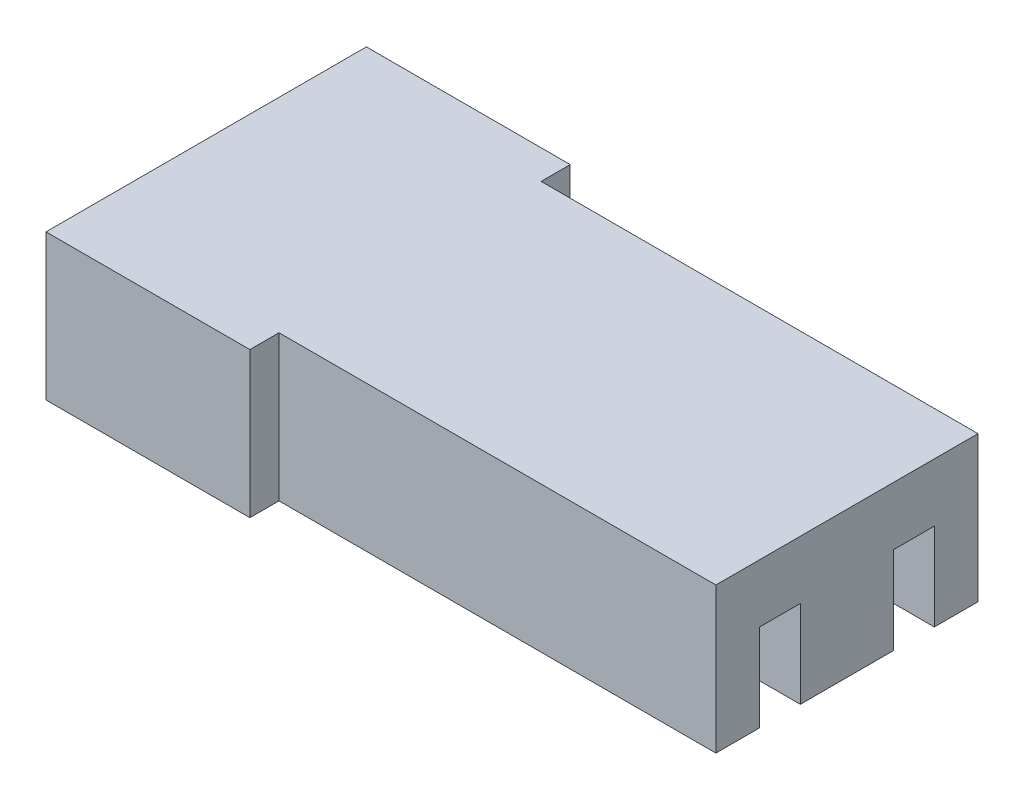
ISO-10303-21;
HEADER;
FILE_DESCRIPTION(('STEP AP214'),'2;1');
FILE_NAME('part.step','',(''),(''),'','','');
FILE_SCHEMA(('AUTOMOTIVE_DESIGN { 1 0 10303 214 1 1 1 1 }'));
ENDSEC;
DATA;
#1=APPLICATION_CONTEXT('core data for automotive mechanical design processes');
#2=APPLICATION_PROTOCOL_DEFINITION('international standard','automotive_design',2000,#1);
#3=PRODUCT_CONTEXT('',#1,'mechanical');
#4=PRODUCT('Part','Part','',(#3));
#5=PRODUCT_RELATED_PRODUCT_CATEGORY('part','',(#4));
#6=PRODUCT_DEFINITION_FORMATION('','',#4);
#7=PRODUCT_DEFINITION_CONTEXT('part definition',#1,'design');
#8=PRODUCT_DEFINITION('design','',#6,#7);
#9=PRODUCT_DEFINITION_SHAPE('','',#8);
#10=(LENGTH_UNIT() NAMED_UNIT(*) SI_UNIT(.MILLI.,.METRE.));
#11=(NAMED_UNIT(*) PLANE_ANGLE_UNIT() SI_UNIT($,.RADIAN.));
#12=(NAMED_UNIT(*) SI_UNIT($,.STERADIAN.) SOLID_ANGLE_UNIT());
#13=UNCERTAINTY_MEASURE_WITH_UNIT(LENGTH_MEASURE(1.E-05),#10,'distance_accuracy_value','');
#14=(GEOMETRIC_REPRESENTATION_CONTEXT(3) GLOBAL_UNCERTAINTY_ASSIGNED_CONTEXT((#13)) GLOBAL_UNIT_ASSIGNED_CONTEXT((#10,
#11,#12)) REPRESENTATION_CONTEXT('',''));
#15=CARTESIAN_POINT('',(0.,0.,0.));
#16=DIRECTION('',(0.,0.,1.));
#17=DIRECTION('',(1.,0.,0.));
#18=AXIS2_PLACEMENT_3D('',#15,#16,#17);
#19=CARTESIAN_POINT('',(7.5,2.,-4.5));
#20=DIRECTION('',(-1.,0.,0.));
#21=DIRECTION('',(0.,0.,1.));
#22=AXIS2_PLACEMENT_3D('',#19,#20,#21);
#23=PLANE('',#22);
#24=DIRECTION('',(0.,-1.,0.));
#25=VECTOR('',#24,1.);
#26=CARTESIAN_POINT('',(7.5,2.,4.5));
#27=LINE('',#26,#25);
#28=CARTESIAN_POINT('',(7.5,2.,4.5));
#29=VERTEX_POINT('',#28);
#30=CARTESIAN_POINT('',(7.5,-3.,4.5));
#31=VERTEX_POINT('',#30);
#32=EDGE_CURVE('E455',#29,#31,#27,.T.);
#33=ORIENTED_EDGE('',*,*,#32,.T.);
#34=DIRECTION('',(0.,0.,-1.));
#35=VECTOR('',#34,1.);
#36=CARTESIAN_POINT('',(7.5,-3.,3.));
#37=LINE('',#36,#35);
#38=CARTESIAN_POINT('',(7.5,-3.,3.));
#39=VERTEX_POINT('',#38);
#40=EDGE_CURVE('E319',#31,#39,#37,.T.);
#41=ORIENTED_EDGE('',*,*,#40,.T.);
#42=DIRECTION('',(0.,1.,0.));
#43=VECTOR('',#42,1.);
#44=CARTESIAN_POINT('',(7.5,-3.,3.));
#45=LINE('',#44,#43);
#46=CARTESIAN_POINT('',(7.5,0.,3.));
#47=VERTEX_POINT('',#46);
#48=EDGE_CURVE('E351',#39,#47,#45,.T.);
#49=ORIENTED_EDGE('',*,*,#48,.T.);
#50=DIRECTION('',(0.,0.,-1.));
#51=VECTOR('',#50,1.);
#52=CARTESIAN_POINT('',(7.5,0.,-4.5));
#53=LINE('',#52,#51);
#54=CARTESIAN_POINT('',(7.5,0.,1.6));
#55=VERTEX_POINT('',#54);
#56=EDGE_CURVE('E456',#47,#55,#53,.T.);
#57=ORIENTED_EDGE('',*,*,#56,.T.);
#58=DIRECTION('',(0.,1.,0.));
#59=VECTOR('',#58,1.);
#60=CARTESIAN_POINT('',(7.5,-3.,1.6));
#61=LINE('',#60,#59);
#62=CARTESIAN_POINT('',(7.5,-3.,1.6));
#63=VERTEX_POINT('',#62);
#64=EDGE_CURVE('E314',#63,#55,#61,.T.);
#65=ORIENTED_EDGE('',*,*,#64,.F.);
#66=DIRECTION('',(0.,0.,-1.));
#67=VECTOR('',#66,1.);
#68=CARTESIAN_POINT('',(7.5,-3.,-1.6));
#69=LINE('',#68,#67);
#70=CARTESIAN_POINT('',(7.5,-3.,-1.6));
#71=VERTEX_POINT('',#70);
#72=EDGE_CURVE('E288',#63,#71,#69,.T.);
#73=ORIENTED_EDGE('',*,*,#72,.T.);
#74=DIRECTION('',(0.,1.,0.));
#75=VECTOR('',#74,1.);
#76=CARTESIAN_POINT('',(7.5,-3.,-1.6));
#77=LINE('',#76,#75);
#78=CARTESIAN_POINT('',(7.5,0.,-1.6));
#79=VERTEX_POINT('',#78);
#80=EDGE_CURVE('E311',#71,#79,#77,.T.);
#81=ORIENTED_EDGE('',*,*,#80,.T.);
#82=CARTESIAN_POINT('',(7.5,0.,-3.));
#83=VERTEX_POINT('',#82);
#84=EDGE_CURVE('E420',#79,#83,#53,.T.);
#85=ORIENTED_EDGE('',*,*,#84,.T.);
#86=DIRECTION('',(0.,1.,0.));
#87=VECTOR('',#86,1.);
#88=CARTESIAN_POINT('',(7.5,-3.,-3.));
#89=LINE('',#88,#87);
#90=CARTESIAN_POINT('',(7.5,-3.,-3.));
#91=VERTEX_POINT('',#90);
#92=EDGE_CURVE('E416',#91,#83,#89,.T.);
#93=ORIENTED_EDGE('',*,*,#92,.F.);
#94=DIRECTION('',(0.,0.,-1.));
#95=VECTOR('',#94,1.);
#96=CARTESIAN_POINT('',(7.5,-3.,-3.));
#97=LINE('',#96,#95);
#98=CARTESIAN_POINT('',(7.5,-3.,-4.5));
#99=VERTEX_POINT('',#98);
#100=EDGE_CURVE('E375',#91,#99,#97,.T.);
#101=ORIENTED_EDGE('',*,*,#100,.T.);
#102=DIRECTION('',(0.,-1.,0.));
#103=VECTOR('',#102,1.);
#104=CARTESIAN_POINT('',(7.5,2.,-4.5));
#105=LINE('',#104,#103);
#106=CARTESIAN_POINT('',(7.5,2.,-4.5));
#107=VERTEX_POINT('',#106);
#108=EDGE_CURVE('E483',#107,#99,#105,.T.);
#109=ORIENTED_EDGE('',*,*,#108,.F.);
#110=DIRECTION('',(0.,0.,-1.));
#111=VECTOR('',#110,1.);
#112=CARTESIAN_POINT('',(7.5,2.,-4.5));
#113=LINE('',#112,#111);
#114=EDGE_CURVE('E429',#29,#107,#113,.T.);
#115=ORIENTED_EDGE('',*,*,#114,.F.);
#116=EDGE_LOOP('',(#33,#41,#49,#57,#65,#73,#81,#85,#93,#101,#109,#115));
#117=FACE_BOUND('',#116,.T.);
#118=ADVANCED_FACE('F39',(#117),#23,.F.);
#119=CARTESIAN_POINT('',(-7.5,2.,-4.5));
#120=DIRECTION('',(0.,0.,1.));
#121=DIRECTION('',(1.,0.,0.));
#122=AXIS2_PLACEMENT_3D('',#119,#120,#121);
#123=PLANE('',#122);
#124=ORIENTED_EDGE('',*,*,#108,.T.);
#125=DIRECTION('',(-1.,0.,0.));
#126=VECTOR('',#125,1.);
#127=CARTESIAN_POINT('',(7.5,-3.,-4.5));
#128=LINE('',#127,#126);
#129=CARTESIAN_POINT('',(-7.5,-3.,-4.5));
#130=VERTEX_POINT('',#129);
#131=EDGE_CURVE('E379',#99,#130,#128,.T.);
#132=ORIENTED_EDGE('',*,*,#131,.T.);
#133=DIRECTION('',(0.,-1.,0.));
#134=VECTOR('',#133,1.);
#135=CARTESIAN_POINT('',(-7.5,2.,-4.5));
#136=LINE('',#135,#134);
#137=CARTESIAN_POINT('',(-7.5,2.,-4.5));
#138=VERTEX_POINT('',#137);
#139=EDGE_CURVE('E480',#138,#130,#136,.T.);
#140=ORIENTED_EDGE('',*,*,#139,.F.);
#141=DIRECTION('',(-1.,0.,0.));
#142=VECTOR('',#141,1.);
#143=CARTESIAN_POINT('',(-7.5,2.,-4.5));
#144=LINE('',#143,#142);
#145=EDGE_CURVE('E433',#107,#138,#144,.T.);
#146=ORIENTED_EDGE('',*,*,#145,.F.);
#147=EDGE_LOOP('',(#124,#132,#140,#146));
#148=FACE_BOUND('',#147,.T.);
#149=ADVANCED_FACE('F536',(#148),#123,.F.);
#150=CARTESIAN_POINT('',(-7.5,2.,-4.5));
#151=DIRECTION('',(-1.,0.,0.));
#152=DIRECTION('',(0.,0.,1.));
#153=AXIS2_PLACEMENT_3D('',#150,#151,#152);
#154=PLANE('',#153);
#155=DIRECTION('',(0.,0.,-1.));
#156=VECTOR('',#155,1.);
#157=CARTESIAN_POINT('',(-7.5,-3.,-4.5));
#158=LINE('',#157,#156);
#159=CARTESIAN_POINT('',(-7.5,-3.,-5.5));
#160=VERTEX_POINT('',#159);
#161=EDGE_CURVE('E384',#130,#160,#158,.T.);
#162=ORIENTED_EDGE('',*,*,#161,.T.);
#163=DIRECTION('',(0.,-1.,0.));
#164=VECTOR('',#163,1.);
#165=CARTESIAN_POINT('',(-7.5,2.,-5.5));
#166=LINE('',#165,#164);
#167=CARTESIAN_POINT('',(-7.5,2.,-5.5));
#168=VERTEX_POINT('',#167);
#169=EDGE_CURVE('E477',#168,#160,#166,.T.);
#170=ORIENTED_EDGE('',*,*,#169,.F.);
#171=DIRECTION('',(0.,0.,-1.));
#172=VECTOR('',#171,1.);
#173=CARTESIAN_POINT('',(-7.5,2.,-4.5));
#174=LINE('',#173,#172);
#175=EDGE_CURVE('E437',#138,#168,#174,.T.);
#176=ORIENTED_EDGE('',*,*,#175,.F.);
#177=ORIENTED_EDGE('',*,*,#139,.T.);
#178=EDGE_LOOP('',(#162,#170,#176,#177));
#179=FACE_BOUND('',#178,.T.);
#180=ADVANCED_FACE('F531',(#179),#154,.F.);
#181=CARTESIAN_POINT('',(-7.5,2.,-5.5));
#182=DIRECTION('',(0.,0.,1.));
#183=DIRECTION('',(1.,0.,0.));
#184=AXIS2_PLACEMENT_3D('',#181,#182,#183);
#185=PLANE('',#184);
#186=DIRECTION('',(-1.,0.,0.));
#187=VECTOR('',#186,1.);
#188=CARTESIAN_POINT('',(-7.5,-3.,-5.5));
#189=LINE('',#188,#187);
#190=CARTESIAN_POINT('',(-14.5,-3.,-5.5));
#191=VERTEX_POINT('',#190);
#192=EDGE_CURVE('E388',#160,#191,#189,.T.);
#193=ORIENTED_EDGE('',*,*,#192,.T.);
#194=DIRECTION('',(0.,-1.,0.));
#195=VECTOR('',#194,1.);
#196=CARTESIAN_POINT('',(-14.5,2.,-5.5));
#197=LINE('',#196,#195);
#198=CARTESIAN_POINT('',(-14.5,2.,-5.5));
#199=VERTEX_POINT('',#198);
#200=EDGE_CURVE('E474',#199,#191,#197,.T.);
#201=ORIENTED_EDGE('',*,*,#200,.F.);
#202=DIRECTION('',(-1.,0.,0.));
#203=VECTOR('',#202,1.);
#204=CARTESIAN_POINT('',(-7.5,2.,-5.5));
#205=LINE('',#204,#203);
#206=EDGE_CURVE('E440',#168,#199,#205,.T.);
#207=ORIENTED_EDGE('',*,*,#206,.F.);
#208=ORIENTED_EDGE('',*,*,#169,.T.);
#209=EDGE_LOOP('',(#193,#201,#207,#208));
#210=FACE_BOUND('',#209,.T.);
#211=ADVANCED_FACE('F527',(#210),#185,.F.);
#212=CARTESIAN_POINT('',(-14.5,2.,-5.5));
#213=DIRECTION('',(1.,0.,0.));
#214=DIRECTION('',(0.,0.,-1.));
#215=AXIS2_PLACEMENT_3D('',#212,#213,#214);
#216=PLANE('',#215);
#217=DIRECTION('',(0.,0.,1.));
#218=VECTOR('',#217,1.);
#219=CARTESIAN_POINT('',(-14.5,-3.,-5.5));
#220=LINE('',#219,#218);
#221=CARTESIAN_POINT('',(-14.5,-3.,-2.39113648292669));
#222=VERTEX_POINT('',#221);
#223=EDGE_CURVE('E392',#191,#222,#220,.T.);
#224=ORIENTED_EDGE('',*,*,#223,.T.);
#225=DIRECTION('',(0.,-1.,0.));
#226=VECTOR('',#225,1.);
#227=CARTESIAN_POINT('',(-14.5,-1.,-2.39113648292669));
#228=LINE('',#227,#226);
#229=CARTESIAN_POINT('',(-14.5,-1.,-2.39113648292669));
#230=VERTEX_POINT('',#229);
#231=EDGE_CURVE('E228',#230,#222,#228,.T.);
#232=ORIENTED_EDGE('',*,*,#231,.F.);
#233=DIRECTION('',(0.,0.,-1.));
#234=VECTOR('',#233,1.);
#235=CARTESIAN_POINT('',(-14.5,-1.,-5.5));
#236=LINE('',#235,#234);
#237=CARTESIAN_POINT('',(-14.5,-1.,-3.5));
#238=VERTEX_POINT('',#237);
#239=EDGE_CURVE('E229',#230,#238,#236,.T.);
#240=ORIENTED_EDGE('',*,*,#239,.T.);
#241=DIRECTION('',(0.,1.,0.));
#242=VECTOR('',#241,1.);
#243=CARTESIAN_POINT('',(-14.5,-3.,-3.5));
#244=LINE('',#243,#242);
#245=CARTESIAN_POINT('',(-14.5,0.,-3.5));
#246=VERTEX_POINT('',#245);
#247=EDGE_CURVE('E57',#238,#246,#244,.T.);
#248=ORIENTED_EDGE('',*,*,#247,.T.);
#249=DIRECTION('',(0.,0.,1.));
#250=VECTOR('',#249,1.);
#251=CARTESIAN_POINT('',(-14.5,0.,-5.5));
#252=LINE('',#251,#250);
#253=CARTESIAN_POINT('',(-14.5,0.,3.5));
#254=VERTEX_POINT('',#253);
#255=EDGE_CURVE('E434',#246,#254,#252,.T.);
#256=ORIENTED_EDGE('',*,*,#255,.T.);
#257=DIRECTION('',(0.,1.,0.));
#258=VECTOR('',#257,1.);
#259=CARTESIAN_POINT('',(-14.5,-3.,3.5));
#260=LINE('',#259,#258);
#261=CARTESIAN_POINT('',(-14.5,-1.,3.5));
#262=VERTEX_POINT('',#261);
#263=EDGE_CURVE('E362',#262,#254,#260,.T.);
#264=ORIENTED_EDGE('',*,*,#263,.F.);
#265=DIRECTION('',(0.,0.,-1.));
#266=VECTOR('',#265,1.);
#267=CARTESIAN_POINT('',(-14.5,-1.,5.5));
#268=LINE('',#267,#266);
#269=CARTESIAN_POINT('',(-14.5,-1.,2.39113648292669));
#270=VERTEX_POINT('',#269);
#271=EDGE_CURVE('E249',#262,#270,#268,.T.);
#272=ORIENTED_EDGE('',*,*,#271,.T.);
#273=DIRECTION('',(0.,-1.,0.));
#274=VECTOR('',#273,1.);
#275=CARTESIAN_POINT('',(-14.5,-1.,2.39113648292669));
#276=LINE('',#275,#274);
#277=CARTESIAN_POINT('',(-14.5,-3.,2.39113648292669));
#278=VERTEX_POINT('',#277);
#279=EDGE_CURVE('E261',#270,#278,#276,.T.);
#280=ORIENTED_EDGE('',*,*,#279,.T.);
#281=DIRECTION('',(0.,0.,1.));
#282=VECTOR('',#281,1.);
#283=CARTESIAN_POINT('',(-14.5,-3.,5.5));
#284=LINE('',#283,#282);
#285=CARTESIAN_POINT('',(-14.5,-3.,5.5));
#286=VERTEX_POINT('',#285);
#287=EDGE_CURVE('E335',#278,#286,#284,.T.);
#288=ORIENTED_EDGE('',*,*,#287,.T.);
#289=DIRECTION('',(0.,-1.,0.));
#290=VECTOR('',#289,1.);
#291=CARTESIAN_POINT('',(-14.5,2.,5.5));
#292=LINE('',#291,#290);
#293=CARTESIAN_POINT('',(-14.5,2.,5.5));
#294=VERTEX_POINT('',#293);
#295=EDGE_CURVE('E471',#294,#286,#292,.T.);
#296=ORIENTED_EDGE('',*,*,#295,.F.);
#297=DIRECTION('',(0.,0.,1.));
#298=VECTOR('',#297,1.);
#299=CARTESIAN_POINT('',(-14.5,2.,-5.5));
#300=LINE('',#299,#298);
#301=EDGE_CURVE('E443',#199,#294,#300,.T.);
#302=ORIENTED_EDGE('',*,*,#301,.F.);
#303=ORIENTED_EDGE('',*,*,#200,.T.);
#304=EDGE_LOOP('',(#224,#232,#240,#248,#256,#264,#272,#280,#288,#296,#302,#303));
#305=FACE_BOUND('',#304,.T.);
#306=ADVANCED_FACE('F495',(#305),#216,.F.);
#307=CARTESIAN_POINT('',(-14.5,2.,5.5));
#308=DIRECTION('',(0.,0.,-1.));
#309=DIRECTION('',(-1.,0.,0.));
#310=AXIS2_PLACEMENT_3D('',#307,#308,#309);
#311=PLANE('',#310);
#312=DIRECTION('',(1.,0.,0.));
#313=VECTOR('',#312,1.);
#314=CARTESIAN_POINT('',(-7.5,-3.,5.5));
#315=LINE('',#314,#313);
#316=CARTESIAN_POINT('',(-7.5,-3.,5.5));
#317=VERTEX_POINT('',#316);
#318=EDGE_CURVE('E339',#286,#317,#315,.T.);
#319=ORIENTED_EDGE('',*,*,#318,.T.);
#320=DIRECTION('',(0.,-1.,0.));
#321=VECTOR('',#320,1.);
#322=CARTESIAN_POINT('',(-7.5,2.,5.5));
#323=LINE('',#322,#321);
#324=CARTESIAN_POINT('',(-7.5,2.,5.5));
#325=VERTEX_POINT('',#324);
#326=EDGE_CURVE('E468',#325,#317,#323,.T.);
#327=ORIENTED_EDGE('',*,*,#326,.F.);
#328=DIRECTION('',(1.,0.,0.));
#329=VECTOR('',#328,1.);
#330=CARTESIAN_POINT('',(-14.5,2.,5.5));
#331=LINE('',#330,#329);
#332=EDGE_CURVE('E446',#294,#325,#331,.T.);
#333=ORIENTED_EDGE('',*,*,#332,.F.);
#334=ORIENTED_EDGE('',*,*,#295,.T.);
#335=EDGE_LOOP('',(#319,#327,#333,#334));
#336=FACE_BOUND('',#335,.T.);
#337=ADVANCED_FACE('F514',(#336),#311,.F.);
#338=CARTESIAN_POINT('',(-7.5,2.,5.5));
#339=DIRECTION('',(-1.,0.,0.));
#340=DIRECTION('',(0.,0.,1.));
#341=AXIS2_PLACEMENT_3D('',#338,#339,#340);
#342=PLANE('',#341);
#343=DIRECTION('',(0.,0.,-1.));
#344=VECTOR('',#343,1.);
#345=CARTESIAN_POINT('',(-7.5,-3.,4.5));
#346=LINE('',#345,#344);
#347=CARTESIAN_POINT('',(-7.5,-3.,4.5));
#348=VERTEX_POINT('',#347);
#349=EDGE_CURVE('E343',#317,#348,#346,.T.);
#350=ORIENTED_EDGE('',*,*,#349,.T.);
#351=DIRECTION('',(0.,-1.,0.));
#352=VECTOR('',#351,1.);
#353=CARTESIAN_POINT('',(-7.5,2.,4.5));
#354=LINE('',#353,#352);
#355=CARTESIAN_POINT('',(-7.5,2.,4.5));
#356=VERTEX_POINT('',#355);
#357=EDGE_CURVE('E465',#356,#348,#354,.T.);
#358=ORIENTED_EDGE('',*,*,#357,.F.);
#359=DIRECTION('',(0.,0.,-1.));
#360=VECTOR('',#359,1.);
#361=CARTESIAN_POINT('',(-7.5,2.,5.5));
#362=LINE('',#361,#360);
#363=EDGE_CURVE('E449',#325,#356,#362,.T.);
#364=ORIENTED_EDGE('',*,*,#363,.F.);
#365=ORIENTED_EDGE('',*,*,#326,.T.);
#366=EDGE_LOOP('',(#350,#358,#364,#365));
#367=FACE_BOUND('',#366,.T.);
#368=ADVANCED_FACE('F574',(#367),#342,.F.);
#369=CARTESIAN_POINT('',(-7.5,2.,4.5));
#370=DIRECTION('',(0.,0.,-1.));
#371=DIRECTION('',(-1.,0.,0.));
#372=AXIS2_PLACEMENT_3D('',#369,#370,#371);
#373=PLANE('',#372);
#374=ORIENTED_EDGE('',*,*,#357,.T.);
#375=DIRECTION('',(1.,0.,0.));
#376=VECTOR('',#375,1.);
#377=CARTESIAN_POINT('',(7.5,-3.,4.5));
#378=LINE('',#377,#376);
#379=EDGE_CURVE('E347',#348,#31,#378,.T.);
#380=ORIENTED_EDGE('',*,*,#379,.T.);
#381=ORIENTED_EDGE('',*,*,#32,.F.);
#382=DIRECTION('',(1.,0.,0.));
#383=VECTOR('',#382,1.);
#384=CARTESIAN_POINT('',(-7.5,2.,4.5));
#385=LINE('',#384,#383);
#386=EDGE_CURVE('E452',#356,#29,#385,.T.);
#387=ORIENTED_EDGE('',*,*,#386,.F.);
#388=EDGE_LOOP('',(#374,#380,#381,#387));
#389=FACE_BOUND('',#388,.T.);
#390=ADVANCED_FACE('F577',(#389),#373,.F.);
#391=CARTESIAN_POINT('',(0.,2.,0.));
#392=DIRECTION('',(0.,1.,0.));
#393=DIRECTION('',(0.,0.,1.));
#394=AXIS2_PLACEMENT_3D('',#391,#392,#393);
#395=PLANE('',#394);
#396=ORIENTED_EDGE('',*,*,#114,.T.);
#397=ORIENTED_EDGE('',*,*,#145,.T.);
#398=ORIENTED_EDGE('',*,*,#175,.T.);
#399=ORIENTED_EDGE('',*,*,#206,.T.);
#400=ORIENTED_EDGE('',*,*,#301,.T.);
#401=ORIENTED_EDGE('',*,*,#332,.T.);
#402=ORIENTED_EDGE('',*,*,#363,.T.);
#403=ORIENTED_EDGE('',*,*,#386,.T.);
#404=EDGE_LOOP('',(#396,#397,#398,#399,#400,#401,#402,#403));
#405=FACE_BOUND('',#404,.T.);
#406=ADVANCED_FACE('F517',(#405),#395,.T.);
#407=CARTESIAN_POINT('',(0.,0.,0.));
#408=DIRECTION('',(0.,1.,0.));
#409=DIRECTION('',(0.,0.,1.));
#410=AXIS2_PLACEMENT_3D('',#407,#408,#409);
#411=PLANE('',#410);
#412=ORIENTED_EDGE('',*,*,#84,.F.);
#413=DIRECTION('',(-1.,0.,0.));
#414=VECTOR('',#413,1.);
#415=CARTESIAN_POINT('',(0.5,0.,-1.6));
#416=LINE('',#415,#414);
#417=CARTESIAN_POINT('',(0.5,0.,-1.6));
#418=VERTEX_POINT('',#417);
#419=EDGE_CURVE('E284',#79,#418,#416,.T.);
#420=ORIENTED_EDGE('',*,*,#419,.T.);
#421=DIRECTION('',(0.,0.,1.));
#422=VECTOR('',#421,1.);
#423=CARTESIAN_POINT('',(0.5,0.,1.6));
#424=LINE('',#423,#422);
#425=CARTESIAN_POINT('',(0.5,0.,1.6));
#426=VERTEX_POINT('',#425);
#427=EDGE_CURVE('E278',#418,#426,#424,.T.);
#428=ORIENTED_EDGE('',*,*,#427,.T.);
#429=DIRECTION('',(1.,0.,0.));
#430=VECTOR('',#429,1.);
#431=CARTESIAN_POINT('',(7.5,0.,1.6));
#432=LINE('',#431,#430);
#433=EDGE_CURVE('E300',#426,#55,#432,.T.);
#434=ORIENTED_EDGE('',*,*,#433,.T.);
#435=ORIENTED_EDGE('',*,*,#56,.F.);
#436=DIRECTION('',(-1.,0.,0.));
#437=VECTOR('',#436,1.);
#438=CARTESIAN_POINT('',(0.5,0.,3.));
#439=LINE('',#438,#437);
#440=CARTESIAN_POINT('',(0.5,0.,3.));
#441=VERTEX_POINT('',#440);
#442=EDGE_CURVE('E310',#47,#441,#439,.T.);
#443=ORIENTED_EDGE('',*,*,#442,.T.);
#444=DIRECTION('',(0.,0.,1.));
#445=VECTOR('',#444,1.);
#446=CARTESIAN_POINT('',(0.5,0.,3.5));
#447=LINE('',#446,#445);
#448=CARTESIAN_POINT('',(0.5,0.,3.5));
#449=VERTEX_POINT('',#448);
#450=EDGE_CURVE('E355',#441,#449,#447,.T.);
#451=ORIENTED_EDGE('',*,*,#450,.T.);
#452=DIRECTION('',(-1.,0.,0.));
#453=VECTOR('',#452,1.);
#454=CARTESIAN_POINT('',(-14.5,0.,3.5));
#455=LINE('',#454,#453);
#456=EDGE_CURVE('E324',#449,#254,#455,.T.);
#457=ORIENTED_EDGE('',*,*,#456,.T.);
#458=ORIENTED_EDGE('',*,*,#255,.F.);
#459=DIRECTION('',(1.,0.,0.));
#460=VECTOR('',#459,1.);
#461=CARTESIAN_POINT('',(-14.5,0.,-3.5));
#462=LINE('',#461,#460);
#463=CARTESIAN_POINT('',(0.499999999999999,0.,-3.5));
#464=VERTEX_POINT('',#463);
#465=EDGE_CURVE('E365',#246,#464,#462,.T.);
#466=ORIENTED_EDGE('',*,*,#465,.T.);
#467=DIRECTION('',(0.,0.,1.));
#468=VECTOR('',#467,1.);
#469=CARTESIAN_POINT('',(0.499999999999999,0.,-3.5));
#470=LINE('',#469,#468);
#471=CARTESIAN_POINT('',(0.5,0.,-3.));
#472=VERTEX_POINT('',#471);
#473=EDGE_CURVE('E409',#464,#472,#470,.T.);
#474=ORIENTED_EDGE('',*,*,#473,.T.);
#475=DIRECTION('',(1.,0.,0.));
#476=VECTOR('',#475,1.);
#477=CARTESIAN_POINT('',(0.5,0.,-3.));
#478=LINE('',#477,#476);
#479=EDGE_CURVE('E380',#472,#83,#478,.T.);
#480=ORIENTED_EDGE('',*,*,#479,.T.);
#481=EDGE_LOOP('',(#412,#420,#428,#434,#435,#443,#451,#457,#458,#466,#474,#480));
#482=FACE_BOUND('',#481,.T.);
#483=ADVANCED_FACE('F582',(#482),#411,.F.);
#484=CARTESIAN_POINT('',(0.5,-3.,-3.));
#485=DIRECTION('',(0.,0.,1.));
#486=DIRECTION('',(1.,0.,0.));
#487=AXIS2_PLACEMENT_3D('',#484,#485,#486);
#488=PLANE('',#487);
#489=ORIENTED_EDGE('',*,*,#479,.F.);
#490=DIRECTION('',(0.,1.,0.));
#491=VECTOR('',#490,1.);
#492=CARTESIAN_POINT('',(0.5,-3.,-3.));
#493=LINE('',#492,#491);
#494=CARTESIAN_POINT('',(0.5,-3.,-3.));
#495=VERTEX_POINT('',#494);
#496=EDGE_CURVE('E421',#495,#472,#493,.T.);
#497=ORIENTED_EDGE('',*,*,#496,.F.);
#498=DIRECTION('',(1.,0.,0.));
#499=VECTOR('',#498,1.);
#500=CARTESIAN_POINT('',(0.5,-3.,-3.));
#501=LINE('',#500,#499);
#502=EDGE_CURVE('E402',#495,#91,#501,.T.);
#503=ORIENTED_EDGE('',*,*,#502,.T.);
#504=ORIENTED_EDGE('',*,*,#92,.T.);
#505=EDGE_LOOP('',(#489,#497,#503,#504));
#506=FACE_BOUND('',#505,.T.);
#507=ADVANCED_FACE('F544',(#506),#488,.T.);
#508=CARTESIAN_POINT('',(0.499999999999999,-3.,-3.5));
#509=DIRECTION('',(-1.,0.,0.));
#510=DIRECTION('',(0.,0.,1.));
#511=AXIS2_PLACEMENT_3D('',#508,#509,#510);
#512=PLANE('',#511);
#513=ORIENTED_EDGE('',*,*,#473,.F.);
#514=DIRECTION('',(0.,1.,0.));
#515=VECTOR('',#514,1.);
#516=CARTESIAN_POINT('',(0.499999999999999,-3.,-3.5));
#517=LINE('',#516,#515);
#518=CARTESIAN_POINT('',(0.499999999999999,-3.,-3.5));
#519=VERTEX_POINT('',#518);
#520=EDGE_CURVE('E424',#519,#464,#517,.T.);
#521=ORIENTED_EDGE('',*,*,#520,.F.);
#522=DIRECTION('',(0.,0.,1.));
#523=VECTOR('',#522,1.);
#524=CARTESIAN_POINT('',(0.499999999999999,-3.,-3.5));
#525=LINE('',#524,#523);
#526=EDGE_CURVE('E398',#519,#495,#525,.T.);
#527=ORIENTED_EDGE('',*,*,#526,.T.);
#528=ORIENTED_EDGE('',*,*,#496,.T.);
#529=EDGE_LOOP('',(#513,#521,#527,#528));
#530=FACE_BOUND('',#529,.T.);
#531=ADVANCED_FACE('F548',(#530),#512,.T.);
#532=CARTESIAN_POINT('',(-14.5,-3.,-3.5));
#533=DIRECTION('',(0.,0.,1.));
#534=DIRECTION('',(1.,0.,0.));
#535=AXIS2_PLACEMENT_3D('',#532,#533,#534);
#536=PLANE('',#535);
#537=DIRECTION('',(0.,1.,0.));
#538=VECTOR('',#537,1.);
#539=CARTESIAN_POINT('',(-7.5,-3.,-3.5));
#540=LINE('',#539,#538);
#541=CARTESIAN_POINT('',(-7.5,-3.,-3.5));
#542=VERTEX_POINT('',#541);
#543=CARTESIAN_POINT('',(-7.5,-1.,-3.5));
#544=VERTEX_POINT('',#543);
#545=EDGE_CURVE('E215',#542,#544,#540,.T.);
#546=ORIENTED_EDGE('',*,*,#545,.F.);
#547=DIRECTION('',(1.,0.,0.));
#548=VECTOR('',#547,1.);
#549=CARTESIAN_POINT('',(-14.5,-3.,-3.5));
#550=LINE('',#549,#548);
#551=EDGE_CURVE('E395',#542,#519,#550,.T.);
#552=ORIENTED_EDGE('',*,*,#551,.T.);
#553=ORIENTED_EDGE('',*,*,#520,.T.);
#554=ORIENTED_EDGE('',*,*,#465,.F.);
#555=ORIENTED_EDGE('',*,*,#247,.F.);
#556=DIRECTION('',(1.,0.,0.));
#557=VECTOR('',#556,1.);
#558=CARTESIAN_POINT('',(-14.5,-1.,-3.5));
#559=LINE('',#558,#557);
#560=EDGE_CURVE('E11',#238,#544,#559,.T.);
#561=ORIENTED_EDGE('',*,*,#560,.T.);
#562=EDGE_LOOP('',(#546,#552,#553,#554,#555,#561));
#563=FACE_BOUND('',#562,.T.);
#564=ADVANCED_FACE('F549',(#563),#536,.T.);
#565=CARTESIAN_POINT('',(0.,-3.,0.));
#566=DIRECTION('',(0.,1.,0.));
#567=DIRECTION('',(0.,0.,1.));
#568=AXIS2_PLACEMENT_3D('',#565,#566,#567);
#569=PLANE('',#568);
#570=ORIENTED_EDGE('',*,*,#551,.F.);
#571=DIRECTION('',(0.,0.,1.));
#572=VECTOR('',#571,1.);
#573=CARTESIAN_POINT('',(-7.5,-3.,-5.5));
#574=LINE('',#573,#572);
#575=CARTESIAN_POINT('',(-7.5,-3.,-2.39113648292669));
#576=VERTEX_POINT('',#575);
#577=EDGE_CURVE('E239',#542,#576,#574,.T.);
#578=ORIENTED_EDGE('',*,*,#577,.T.);
#579=DIRECTION('',(-1.,0.,0.));
#580=VECTOR('',#579,1.);
#581=CARTESIAN_POINT('',(-7.5,-3.,-2.39113648292669));
#582=LINE('',#581,#580);
#583=EDGE_CURVE('E220',#576,#222,#582,.T.);
#584=ORIENTED_EDGE('',*,*,#583,.T.);
#585=ORIENTED_EDGE('',*,*,#223,.F.);
#586=ORIENTED_EDGE('',*,*,#192,.F.);
#587=ORIENTED_EDGE('',*,*,#161,.F.);
#588=ORIENTED_EDGE('',*,*,#131,.F.);
#589=ORIENTED_EDGE('',*,*,#100,.F.);
#590=ORIENTED_EDGE('',*,*,#502,.F.);
#591=ORIENTED_EDGE('',*,*,#526,.F.);
#592=EDGE_LOOP('',(#570,#578,#584,#585,#586,#587,#588,#589,#590,#591));
#593=FACE_BOUND('',#592,.T.);
#594=ADVANCED_FACE('F525',(#593),#569,.F.);
#595=CARTESIAN_POINT('',(-14.5,-3.,3.5));
#596=DIRECTION('',(0.,0.,-1.));
#597=DIRECTION('',(-1.,0.,0.));
#598=AXIS2_PLACEMENT_3D('',#595,#596,#597);
#599=PLANE('',#598);
#600=DIRECTION('',(0.,-1.,0.));
#601=VECTOR('',#600,1.);
#602=CARTESIAN_POINT('',(-7.5,-3.,3.5));
#603=LINE('',#602,#601);
#604=CARTESIAN_POINT('',(-7.5,-1.,3.5));
#605=VERTEX_POINT('',#604);
#606=CARTESIAN_POINT('',(-7.5,-3.,3.5));
#607=VERTEX_POINT('',#606);
#608=EDGE_CURVE('E271',#605,#607,#603,.T.);
#609=ORIENTED_EDGE('',*,*,#608,.F.);
#610=DIRECTION('',(-1.,0.,0.));
#611=VECTOR('',#610,1.);
#612=CARTESIAN_POINT('',(-14.5,-1.,3.5));
#613=LINE('',#612,#611);
#614=EDGE_CURVE('E47',#605,#262,#613,.T.);
#615=ORIENTED_EDGE('',*,*,#614,.T.);
#616=ORIENTED_EDGE('',*,*,#263,.T.);
#617=ORIENTED_EDGE('',*,*,#456,.F.);
#618=DIRECTION('',(0.,1.,0.));
#619=VECTOR('',#618,1.);
#620=CARTESIAN_POINT('',(0.5,-3.,3.5));
#621=LINE('',#620,#619);
#622=CARTESIAN_POINT('',(0.5,-3.,3.5));
#623=VERTEX_POINT('',#622);
#624=EDGE_CURVE('E366',#623,#449,#621,.T.);
#625=ORIENTED_EDGE('',*,*,#624,.F.);
#626=DIRECTION('',(-1.,0.,0.));
#627=VECTOR('',#626,1.);
#628=CARTESIAN_POINT('',(-14.5,-3.,3.5));
#629=LINE('',#628,#627);
#630=EDGE_CURVE('E332',#623,#607,#629,.T.);
#631=ORIENTED_EDGE('',*,*,#630,.T.);
#632=EDGE_LOOP('',(#609,#615,#616,#617,#625,#631));
#633=FACE_BOUND('',#632,.T.);
#634=ADVANCED_FACE('F489',(#633),#599,.T.);
#635=CARTESIAN_POINT('',(0.5,-3.,3.5));
#636=DIRECTION('',(-1.,0.,0.));
#637=DIRECTION('',(0.,0.,1.));
#638=AXIS2_PLACEMENT_3D('',#635,#636,#637);
#639=PLANE('',#638);
#640=ORIENTED_EDGE('',*,*,#450,.F.);
#641=DIRECTION('',(0.,1.,0.));
#642=VECTOR('',#641,1.);
#643=CARTESIAN_POINT('',(0.5,-3.,3.));
#644=LINE('',#643,#642);
#645=CARTESIAN_POINT('',(0.5,-3.,3.));
#646=VERTEX_POINT('',#645);
#647=EDGE_CURVE('E369',#646,#441,#644,.T.);
#648=ORIENTED_EDGE('',*,*,#647,.F.);
#649=DIRECTION('',(0.,0.,1.));
#650=VECTOR('',#649,1.);
#651=CARTESIAN_POINT('',(0.5,-3.,3.5));
#652=LINE('',#651,#650);
#653=EDGE_CURVE('E328',#646,#623,#652,.T.);
#654=ORIENTED_EDGE('',*,*,#653,.T.);
#655=ORIENTED_EDGE('',*,*,#624,.T.);
#656=EDGE_LOOP('',(#640,#648,#654,#655));
#657=FACE_BOUND('',#656,.T.);
#658=ADVANCED_FACE('F610',(#657),#639,.T.);
#659=CARTESIAN_POINT('',(0.5,-3.,3.));
#660=DIRECTION('',(0.,0.,-1.));
#661=DIRECTION('',(-1.,0.,0.));
#662=AXIS2_PLACEMENT_3D('',#659,#660,#661);
#663=PLANE('',#662);
#664=ORIENTED_EDGE('',*,*,#442,.F.);
#665=ORIENTED_EDGE('',*,*,#48,.F.);
#666=DIRECTION('',(-1.,0.,0.));
#667=VECTOR('',#666,1.);
#668=CARTESIAN_POINT('',(0.5,-3.,3.));
#669=LINE('',#668,#667);
#670=EDGE_CURVE('E323',#39,#646,#669,.T.);
#671=ORIENTED_EDGE('',*,*,#670,.T.);
#672=ORIENTED_EDGE('',*,*,#647,.T.);
#673=EDGE_LOOP('',(#664,#665,#671,#672));
#674=FACE_BOUND('',#673,.T.);
#675=ADVANCED_FACE('F615',(#674),#663,.T.);
#676=CARTESIAN_POINT('',(0.,-3.,0.));
#677=DIRECTION('',(0.,-1.,0.));
#678=DIRECTION('',(0.,0.,-1.));
#679=AXIS2_PLACEMENT_3D('',#676,#677,#678);
#680=PLANE('',#679);
#681=ORIENTED_EDGE('',*,*,#379,.F.);
#682=ORIENTED_EDGE('',*,*,#349,.F.);
#683=ORIENTED_EDGE('',*,*,#318,.F.);
#684=ORIENTED_EDGE('',*,*,#287,.F.);
#685=DIRECTION('',(1.,0.,0.));
#686=VECTOR('',#685,1.);
#687=CARTESIAN_POINT('',(-7.5,-3.,2.39113648292669));
#688=LINE('',#687,#686);
#689=CARTESIAN_POINT('',(-7.5,-3.,2.39113648292669));
#690=VERTEX_POINT('',#689);
#691=EDGE_CURVE('E248',#278,#690,#688,.T.);
#692=ORIENTED_EDGE('',*,*,#691,.T.);
#693=DIRECTION('',(0.,0.,1.));
#694=VECTOR('',#693,1.);
#695=CARTESIAN_POINT('',(-7.5,-3.,5.5));
#696=LINE('',#695,#694);
#697=EDGE_CURVE('E253',#690,#607,#696,.T.);
#698=ORIENTED_EDGE('',*,*,#697,.T.);
#699=ORIENTED_EDGE('',*,*,#630,.F.);
#700=ORIENTED_EDGE('',*,*,#653,.F.);
#701=ORIENTED_EDGE('',*,*,#670,.F.);
#702=ORIENTED_EDGE('',*,*,#40,.F.);
#703=EDGE_LOOP('',(#681,#682,#683,#684,#692,#698,#699,#700,#701,#702));
#704=FACE_BOUND('',#703,.T.);
#705=ADVANCED_FACE('F509',(#704),#680,.T.);
#706=CARTESIAN_POINT('',(0.5,-3.,1.6));
#707=DIRECTION('',(-1.,0.,0.));
#708=DIRECTION('',(0.,0.,1.));
#709=AXIS2_PLACEMENT_3D('',#706,#707,#708);
#710=PLANE('',#709);
#711=ORIENTED_EDGE('',*,*,#427,.F.);
#712=DIRECTION('',(0.,1.,0.));
#713=VECTOR('',#712,1.);
#714=CARTESIAN_POINT('',(0.5,-3.,-1.6));
#715=LINE('',#714,#713);
#716=CARTESIAN_POINT('',(0.5,-3.,-1.6));
#717=VERTEX_POINT('',#716);
#718=EDGE_CURVE('E307',#717,#418,#715,.T.);
#719=ORIENTED_EDGE('',*,*,#718,.F.);
#720=DIRECTION('',(0.,0.,1.));
#721=VECTOR('',#720,1.);
#722=CARTESIAN_POINT('',(0.5,-3.,1.6));
#723=LINE('',#722,#721);
#724=CARTESIAN_POINT('',(0.5,-3.,1.6));
#725=VERTEX_POINT('',#724);
#726=EDGE_CURVE('E279',#717,#725,#723,.T.);
#727=ORIENTED_EDGE('',*,*,#726,.T.);
#728=DIRECTION('',(0.,1.,0.));
#729=VECTOR('',#728,1.);
#730=CARTESIAN_POINT('',(0.5,-3.,1.6));
#731=LINE('',#730,#729);
#732=EDGE_CURVE('E296',#725,#426,#731,.T.);
#733=ORIENTED_EDGE('',*,*,#732,.T.);
#734=EDGE_LOOP('',(#711,#719,#727,#733));
#735=FACE_BOUND('',#734,.T.);
#736=ADVANCED_FACE('F634',(#735),#710,.T.);
#737=CARTESIAN_POINT('',(0.5,-3.,-1.6));
#738=DIRECTION('',(0.,0.,-1.));
#739=DIRECTION('',(-1.,0.,0.));
#740=AXIS2_PLACEMENT_3D('',#737,#738,#739);
#741=PLANE('',#740);
#742=ORIENTED_EDGE('',*,*,#419,.F.);
#743=ORIENTED_EDGE('',*,*,#80,.F.);
#744=DIRECTION('',(-1.,0.,0.));
#745=VECTOR('',#744,1.);
#746=CARTESIAN_POINT('',(0.5,-3.,-1.6));
#747=LINE('',#746,#745);
#748=EDGE_CURVE('E292',#71,#717,#747,.T.);
#749=ORIENTED_EDGE('',*,*,#748,.T.);
#750=ORIENTED_EDGE('',*,*,#718,.T.);
#751=EDGE_LOOP('',(#742,#743,#749,#750));
#752=FACE_BOUND('',#751,.T.);
#753=ADVANCED_FACE('F639',(#752),#741,.T.);
#754=CARTESIAN_POINT('',(7.5,-3.,1.6));
#755=DIRECTION('',(0.,0.,1.));
#756=DIRECTION('',(1.,0.,0.));
#757=AXIS2_PLACEMENT_3D('',#754,#755,#756);
#758=PLANE('',#757);
#759=ORIENTED_EDGE('',*,*,#433,.F.);
#760=ORIENTED_EDGE('',*,*,#732,.F.);
#761=DIRECTION('',(1.,0.,0.));
#762=VECTOR('',#761,1.);
#763=CARTESIAN_POINT('',(7.5,-3.,1.6));
#764=LINE('',#763,#762);
#765=EDGE_CURVE('E283',#725,#63,#764,.T.);
#766=ORIENTED_EDGE('',*,*,#765,.T.);
#767=ORIENTED_EDGE('',*,*,#64,.T.);
#768=EDGE_LOOP('',(#759,#760,#766,#767));
#769=FACE_BOUND('',#768,.T.);
#770=ADVANCED_FACE('F649',(#769),#758,.T.);
#771=CARTESIAN_POINT('',(0.,-3.,0.));
#772=DIRECTION('',(0.,-1.,0.));
#773=DIRECTION('',(0.,0.,-1.));
#774=AXIS2_PLACEMENT_3D('',#771,#772,#773);
#775=PLANE('',#774);
#776=ORIENTED_EDGE('',*,*,#726,.F.);
#777=ORIENTED_EDGE('',*,*,#748,.F.);
#778=ORIENTED_EDGE('',*,*,#72,.F.);
#779=ORIENTED_EDGE('',*,*,#765,.F.);
#780=EDGE_LOOP('',(#776,#777,#778,#779));
#781=FACE_BOUND('',#780,.T.);
#782=ADVANCED_FACE('F659',(#781),#775,.T.);
#783=CARTESIAN_POINT('',(-7.5,-1.,5.5));
#784=DIRECTION('',(1.,0.,0.));
#785=DIRECTION('',(0.,0.,-1.));
#786=AXIS2_PLACEMENT_3D('',#783,#784,#785);
#787=PLANE('',#786);
#788=DIRECTION('',(0.,0.,1.));
#789=VECTOR('',#788,1.);
#790=CARTESIAN_POINT('',(-7.5,-1.,5.5));
#791=LINE('',#790,#789);
#792=CARTESIAN_POINT('',(-7.5,-1.,2.39113648292669));
#793=VERTEX_POINT('',#792);
#794=EDGE_CURVE('E257',#793,#605,#791,.T.);
#795=ORIENTED_EDGE('',*,*,#794,.T.);
#796=ORIENTED_EDGE('',*,*,#608,.T.);
#797=ORIENTED_EDGE('',*,*,#697,.F.);
#798=DIRECTION('',(0.,-1.,0.));
#799=VECTOR('',#798,1.);
#800=CARTESIAN_POINT('',(-7.5,-1.,2.39113648292669));
#801=LINE('',#800,#799);
#802=EDGE_CURVE('E268',#793,#690,#801,.T.);
#803=ORIENTED_EDGE('',*,*,#802,.F.);
#804=EDGE_LOOP('',(#795,#796,#797,#803));
#805=FACE_BOUND('',#804,.T.);
#806=ADVANCED_FACE('F668',(#805),#787,.T.);
#807=CARTESIAN_POINT('',(-7.5,-1.,2.39113648292669));
#808=DIRECTION('',(0.,0.,-1.));
#809=DIRECTION('',(-1.,0.,0.));
#810=AXIS2_PLACEMENT_3D('',#807,#808,#809);
#811=PLANE('',#810);
#812=ORIENTED_EDGE('',*,*,#691,.F.);
#813=ORIENTED_EDGE('',*,*,#279,.F.);
#814=DIRECTION('',(1.,0.,0.));
#815=VECTOR('',#814,1.);
#816=CARTESIAN_POINT('',(-7.5,-1.,2.39113648292669));
#817=LINE('',#816,#815);
#818=EDGE_CURVE('E252',#270,#793,#817,.T.);
#819=ORIENTED_EDGE('',*,*,#818,.T.);
#820=ORIENTED_EDGE('',*,*,#802,.T.);
#821=EDGE_LOOP('',(#812,#813,#819,#820));
#822=FACE_BOUND('',#821,.T.);
#823=ADVANCED_FACE('F502',(#822),#811,.T.);
#824=CARTESIAN_POINT('',(0.,-1.,0.));
#825=DIRECTION('',(0.,-1.,0.));
#826=DIRECTION('',(0.,0.,-1.));
#827=AXIS2_PLACEMENT_3D('',#824,#825,#826);
#828=PLANE('',#827);
#829=ORIENTED_EDGE('',*,*,#614,.F.);
#830=ORIENTED_EDGE('',*,*,#794,.F.);
#831=ORIENTED_EDGE('',*,*,#818,.F.);
#832=ORIENTED_EDGE('',*,*,#271,.F.);
#833=EDGE_LOOP('',(#829,#830,#831,#832));
#834=FACE_BOUND('',#833,.T.);
#835=ADVANCED_FACE('F499',(#834),#828,.F.);
#836=CARTESIAN_POINT('',(-7.5,-1.,-5.5));
#837=DIRECTION('',(1.,0.,0.));
#838=DIRECTION('',(0.,0.,-1.));
#839=AXIS2_PLACEMENT_3D('',#836,#837,#838);
#840=PLANE('',#839);
#841=ORIENTED_EDGE('',*,*,#577,.F.);
#842=ORIENTED_EDGE('',*,*,#545,.T.);
#843=DIRECTION('',(0.,0.,1.));
#844=VECTOR('',#843,1.);
#845=CARTESIAN_POINT('',(-7.5,-1.,-5.5));
#846=LINE('',#845,#844);
#847=CARTESIAN_POINT('',(-7.5,-1.,-2.39113648292669));
#848=VERTEX_POINT('',#847);
#849=EDGE_CURVE('E209',#544,#848,#846,.T.);
#850=ORIENTED_EDGE('',*,*,#849,.T.);
#851=DIRECTION('',(0.,-1.,0.));
#852=VECTOR('',#851,1.);
#853=CARTESIAN_POINT('',(-7.5,-1.,-2.39113648292669));
#854=LINE('',#853,#852);
#855=EDGE_CURVE('E213',#848,#576,#854,.T.);
#856=ORIENTED_EDGE('',*,*,#855,.T.);
#857=EDGE_LOOP('',(#841,#842,#850,#856));
#858=FACE_BOUND('',#857,.T.);
#859=ADVANCED_FACE('F212',(#858),#840,.T.);
#860=CARTESIAN_POINT('',(-7.5,-1.,-2.39113648292669));
#861=DIRECTION('',(0.,0.,1.));
#862=DIRECTION('',(1.,0.,0.));
#863=AXIS2_PLACEMENT_3D('',#860,#861,#862);
#864=PLANE('',#863);
#865=ORIENTED_EDGE('',*,*,#583,.F.);
#866=ORIENTED_EDGE('',*,*,#855,.F.);
#867=DIRECTION('',(-1.,0.,0.));
#868=VECTOR('',#867,1.);
#869=CARTESIAN_POINT('',(-7.5,-1.,-2.39113648292669));
#870=LINE('',#869,#868);
#871=EDGE_CURVE('E219',#848,#230,#870,.T.);
#872=ORIENTED_EDGE('',*,*,#871,.T.);
#873=ORIENTED_EDGE('',*,*,#231,.T.);
#874=EDGE_LOOP('',(#865,#866,#872,#873));
#875=FACE_BOUND('',#874,.T.);
#876=ADVANCED_FACE('F224',(#875),#864,.T.);
#877=CARTESIAN_POINT('',(0.,-1.,0.));
#878=DIRECTION('',(0.,-1.,0.));
#879=DIRECTION('',(0.,0.,-1.));
#880=AXIS2_PLACEMENT_3D('',#877,#878,#879);
#881=PLANE('',#880);
#882=ORIENTED_EDGE('',*,*,#560,.F.);
#883=ORIENTED_EDGE('',*,*,#239,.F.);
#884=ORIENTED_EDGE('',*,*,#871,.F.);
#885=ORIENTED_EDGE('',*,*,#849,.F.);
#886=EDGE_LOOP('',(#882,#883,#884,#885));
#887=FACE_BOUND('',#886,.T.);
#888=ADVANCED_FACE('F232',(#887),#881,.F.);
#889=CLOSED_SHELL('',(#118,#149,#180,#211,#306,#337,#368,#390,#406,#483,#507,#531,#564,#594,
#634,#658,#675,#705,#736,#753,#770,#782,#806,#823,#835,#859,#876,#888));
#890=MANIFOLD_SOLID_BREP('B2',#889);
#891=ADVANCED_BREP_SHAPE_REPRESENTATION('',(#18,#890),#14);
#892=SHAPE_DEFINITION_REPRESENTATION(#9,#891);
ENDSEC;
END-ISO-10303-21;
